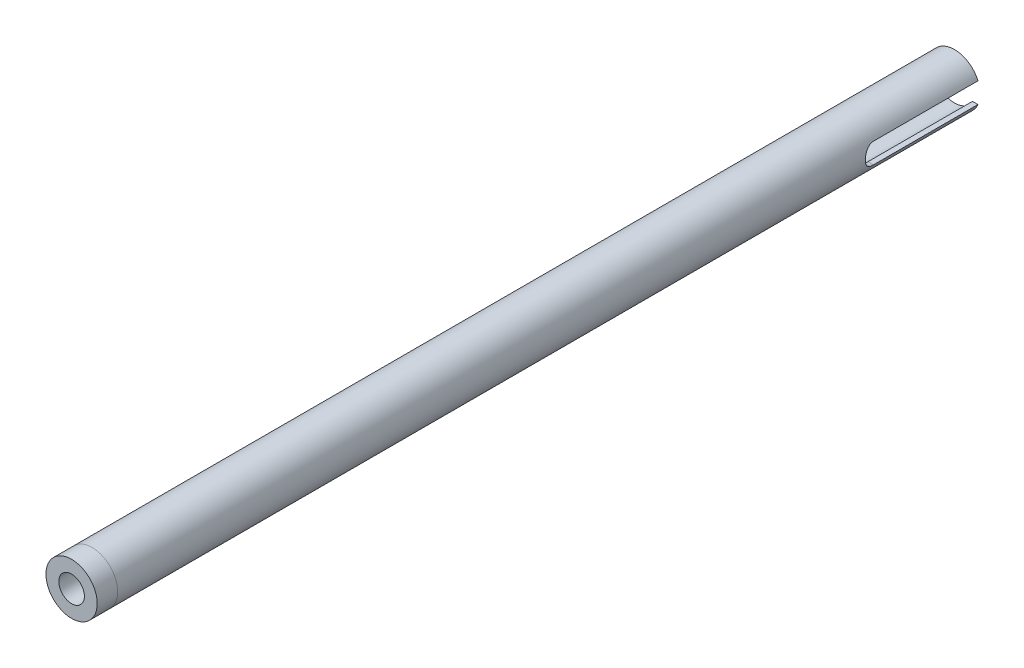
ISO-10303-21;
HEADER;
FILE_DESCRIPTION(('STEP AP214'),'2;1');
FILE_NAME('part.step','',(''),(''),'','','');
FILE_SCHEMA(('AUTOMOTIVE_DESIGN { 1 0 10303 214 1 1 1 1 }'));
ENDSEC;
DATA;
#1=APPLICATION_CONTEXT('core data for automotive mechanical design processes');
#2=APPLICATION_PROTOCOL_DEFINITION('international standard','automotive_design',2000,#1);
#3=PRODUCT_CONTEXT('',#1,'mechanical');
#4=PRODUCT('Part','Part','',(#3));
#5=PRODUCT_RELATED_PRODUCT_CATEGORY('part','',(#4));
#6=PRODUCT_DEFINITION_FORMATION('','',#4);
#7=PRODUCT_DEFINITION_CONTEXT('part definition',#1,'design');
#8=PRODUCT_DEFINITION('design','',#6,#7);
#9=PRODUCT_DEFINITION_SHAPE('','',#8);
#10=(LENGTH_UNIT() NAMED_UNIT(*) SI_UNIT(.MILLI.,.METRE.));
#11=(NAMED_UNIT(*) PLANE_ANGLE_UNIT() SI_UNIT($,.RADIAN.));
#12=(NAMED_UNIT(*) SI_UNIT($,.STERADIAN.) SOLID_ANGLE_UNIT());
#13=UNCERTAINTY_MEASURE_WITH_UNIT(LENGTH_MEASURE(1.E-05),#10,'distance_accuracy_value','');
#14=(GEOMETRIC_REPRESENTATION_CONTEXT(3) GLOBAL_UNCERTAINTY_ASSIGNED_CONTEXT((#13)) GLOBAL_UNIT_ASSIGNED_CONTEXT((#10,
#11,#12)) REPRESENTATION_CONTEXT('',''));
#15=CARTESIAN_POINT('',(0.,0.,0.));
#16=DIRECTION('',(0.,0.,1.));
#17=DIRECTION('',(1.,0.,0.));
#18=AXIS2_PLACEMENT_3D('',#15,#16,#17);
#19=CARTESIAN_POINT('',(0.,0.,-273.485359932268));
#20=DIRECTION('',(0.,0.,1.));
#21=DIRECTION('',(1.,0.,0.));
#22=AXIS2_PLACEMENT_3D('',#19,#20,#21);
#23=CYLINDRICAL_SURFACE('',#22,7.9375);
#24=CARTESIAN_POINT('',(0.,0.,-6.35));
#25=DIRECTION('',(0.,0.,1.));
#26=DIRECTION('',(1.,0.,0.));
#27=AXIS2_PLACEMENT_3D('',#24,#25,#26);
#28=CIRCLE('',#27,7.9375);
#29=CARTESIAN_POINT('',(7.9375,0.,-6.35));
#30=VERTEX_POINT('',#29);
#31=EDGE_CURVE('E167',#30,#30,#28,.T.);
#32=ORIENTED_EDGE('',*,*,#31,.F.);
#33=EDGE_LOOP('',(#32));
#34=FACE_BOUND('',#33,.T.);
#35=CARTESIAN_POINT('',(-7.2748389157424,3.175,-241.100359932268));
#36=CARTESIAN_POINT('',(-7.27482137043434,3.17501267173453,-241.014939816786));
#37=CARTESIAN_POINT('',(-7.27634297592672,3.17155313247793,-240.929529287223));
#38=CARTESIAN_POINT('',(-7.28233338484875,3.15778866907725,-240.759397282895));
#39=CARTESIAN_POINT('',(-7.28680106535325,3.14748635311323,-240.674675558036));
#40=CARTESIAN_POINT('',(-7.29852916312671,3.12019002880163,-240.506861858227));
#41=CARTESIAN_POINT('',(-7.30577831906487,3.10322299732752,-240.423764713468));
#42=CARTESIAN_POINT('',(-7.32282161153745,3.06278779397034,-240.259453611442));
#43=CARTESIAN_POINT('',(-7.33261590324725,3.03931922568673,-240.178239769329));
#44=CARTESIAN_POINT('',(-7.36535331460444,2.9595292434296,-239.938414946746));
#45=CARTESIAN_POINT('',(-7.3916759567784,2.89376893609236,-239.783290017943));
#46=CARTESIAN_POINT('',(-7.45033259991548,2.73920602658921,-239.486202591231));
#47=CARTESIAN_POINT('',(-7.48267254395243,2.65038060922871,-239.344253316014));
#48=CARTESIAN_POINT('',(-7.55175295441386,2.44684429809695,-239.069532546494));
#49=CARTESIAN_POINT('',(-7.58863404630154,2.33103943595689,-238.937605161982));
#50=CARTESIAN_POINT('',(-7.66147718953598,2.07914562663536,-238.69444227835));
#51=CARTESIAN_POINT('',(-7.69743902899202,1.94305205135847,-238.583211513423));
#52=CARTESIAN_POINT('',(-7.76611692840652,1.64778282664419,-238.380290313927));
#53=CARTESIAN_POINT('',(-7.79864638434712,1.48790317306356,-238.289555902523));
#54=CARTESIAN_POINT('',(-7.85502980346525,1.15369615984564,-238.136698349106));
#55=CARTESIAN_POINT('',(-7.87889360585224,0.979385463602719,-238.074542736488));
#56=CARTESIAN_POINT('',(-7.91022225039827,0.670405323433344,-237.994031092832));
#57=CARTESIAN_POINT('',(-7.92038443902171,0.537888188660429,-237.968353169423));
#58=CARTESIAN_POINT('',(-7.93061686811603,0.337231082382099,-237.942598086342));
#59=CARTESIAN_POINT('',(-7.93319257341971,0.269991647180292,-237.936139989061));
#60=CARTESIAN_POINT('',(-7.93663621925193,0.135173873369592,-237.927518971309));
#61=CARTESIAN_POINT('',(-7.93750363389236,0.0675954368175841,-237.925357373491));
#62=CARTESIAN_POINT('',(-7.9375,0.,-237.925359932268));
#63=B_SPLINE_CURVE_WITH_KNOTS('',3,(#35,#36,#37,#38,#39,#40,#41,#42,#43,#44,#45,#46,#47,#48,#49,
#50,#51,#52,#53,#54,#55,#56,#57,#58,#59,#60,#61,#62),.UNSPECIFIED.,.F.,.F.,(4,2,2,2,2,2,2,2,2,2,
2,2,2,4),(0.,0.25616079739664,0.512224013007086,0.767261264672294,1.02231406945474,
1.53142416248601,2.041039780479,2.57679273649399,3.11266809162684,3.66991136029741,
4.22651992730647,4.63134321412667,4.83399375866621,5.03670667834029),.UNSPECIFIED.);
#64=CARTESIAN_POINT('',(-7.2748389157424,3.175,-241.100359932268));
#65=VERTEX_POINT('',#64);
#66=CARTESIAN_POINT('',(-7.9375,0.,-237.925359932268));
#67=VERTEX_POINT('',#66);
#68=EDGE_CURVE('E194',#65,#67,#63,.T.);
#69=ORIENTED_EDGE('',*,*,#68,.T.);
#70=CARTESIAN_POINT('',(-7.9375,0.,-237.925359932268));
#71=CARTESIAN_POINT('',(-7.93751279435796,-0.0856973243893161,-237.925347902099));
#72=CARTESIAN_POINT('',(-7.93611246860092,-0.171386675169289,-237.928829269571));
#73=CARTESIAN_POINT('',(-7.93058107051394,-0.342092796869087,-237.942685364906));
#74=CARTESIAN_POINT('',(-7.92645080745519,-0.427109759557717,-237.953058049889));
#75=CARTESIAN_POINT('',(-7.91557399086504,-0.595570690948318,-237.980555243956));
#76=CARTESIAN_POINT('',(-7.90883664469869,-0.679019123580009,-237.997655995229));
#77=CARTESIAN_POINT('',(-7.89293284658536,-0.844038966454647,-238.038423242703));
#78=CARTESIAN_POINT('',(-7.88376629739099,-0.925610301410308,-238.062090001759));
#79=CARTESIAN_POINT('',(-7.8529700783248,-1.16656173687589,-238.142597657458));
#80=CARTESIAN_POINT('',(-7.82802544143957,-1.32244720282991,-238.208990290335));
#81=CARTESIAN_POINT('',(-7.77174407779742,-1.6208190257289,-238.365035694328));
#82=CARTESIAN_POINT('',(-7.74040257287306,-1.76329524966532,-238.454705866391));
#83=CARTESIAN_POINT('',(-7.67287736621953,-2.03755465224645,-238.659159473906));
#84=CARTESIAN_POINT('',(-7.63654472176442,-2.16862853615059,-238.774846330638));
#85=CARTESIAN_POINT('',(-7.56380976030912,-2.41011022612819,-239.026140432347));
#86=CARTESIAN_POINT('',(-7.52740741976911,-2.52050895891189,-239.161756376829));
#87=CARTESIAN_POINT('',(-7.45683282624283,-2.72240939900244,-239.456454871696));
#88=CARTESIAN_POINT('',(-7.42283467350379,-2.81283701743192,-239.616318861611));
#89=CARTESIAN_POINT('',(-7.36333622196319,-2.9651189416839,-239.950444826408));
#90=CARTESIAN_POINT('',(-7.33782422493328,-3.02701262758154,-240.124686564167));
#91=CARTESIAN_POINT('',(-7.30424985403508,-3.10695047193343,-240.432990288818));
#92=CARTESIAN_POINT('',(-7.29331360019112,-3.13238569878911,-240.564849049704));
#93=CARTESIAN_POINT('',(-7.2822797767429,-3.15790858319002,-240.764565931398));
#94=CARTESIAN_POINT('',(-7.27949685702346,-3.16431127275807,-240.831514222158));
#95=CARTESIAN_POINT('',(-7.27577355567174,-3.17285909036155,-240.965755780024));
#96=CARTESIAN_POINT('',(-7.27483380475762,-3.17500276099679,-241.033049157322));
#97=CARTESIAN_POINT('',(-7.2748389157424,-3.175,-241.100359932268));
#98=B_SPLINE_CURVE_WITH_KNOTS('',3,(#70,#71,#72,#73,#74,#75,#76,#77,#78,#79,#80,#81,#82,#83,#84,
#85,#86,#87,#88,#89,#90,#91,#92,#93,#94,#95,#96,#97),.UNSPECIFIED.,.F.,.F.,(4,2,2,2,2,2,2,2,2,2,
2,2,2,4),(0.,0.256996432008006,0.513916713336977,0.769937797705395,1.02596913282158,
1.53722547809955,2.04886511530061,2.58219314099272,3.115754672018,3.67332953074265,
4.23013255190376,4.63306130520187,4.83485003827449,5.03670780985621),.UNSPECIFIED.);
#99=CARTESIAN_POINT('',(-7.2748389157424,-3.175,-241.100359932268));
#100=VERTEX_POINT('',#99);
#101=EDGE_CURVE('E146',#67,#100,#98,.T.);
#102=ORIENTED_EDGE('',*,*,#101,.T.);
#103=DIRECTION('',(0.,0.,-1.));
#104=VECTOR('',#103,1.);
#105=CARTESIAN_POINT('',(-7.2748389157424,-3.175,-237.925359932268));
#106=LINE('',#105,#104);
#107=CARTESIAN_POINT('',(-7.2748389157424,-3.175,-273.485359932268));
#108=VERTEX_POINT('',#107);
#109=EDGE_CURVE('E141',#100,#108,#106,.T.);
#110=ORIENTED_EDGE('',*,*,#109,.T.);
#111=CARTESIAN_POINT('',(0.,0.,-273.485359932268));
#112=DIRECTION('',(0.,0.,1.));
#113=DIRECTION('',(1.,0.,0.));
#114=AXIS2_PLACEMENT_3D('',#111,#112,#113);
#115=CIRCLE('',#114,7.9375);
#116=CARTESIAN_POINT('',(7.2748389157424,-3.175,-273.485359932268));
#117=VERTEX_POINT('',#116);
#118=EDGE_CURVE('E144',#108,#117,#115,.T.);
#119=ORIENTED_EDGE('',*,*,#118,.T.);
#120=DIRECTION('',(0.,0.,-1.));
#121=VECTOR('',#120,1.);
#122=CARTESIAN_POINT('',(7.2748389157424,-3.175,-237.925359932268));
#123=LINE('',#122,#121);
#124=CARTESIAN_POINT('',(7.2748389157424,-3.175,-241.100359932268));
#125=VERTEX_POINT('',#124);
#126=EDGE_CURVE('E427',#125,#117,#123,.T.);
#127=ORIENTED_EDGE('',*,*,#126,.F.);
#128=CARTESIAN_POINT('',(7.2748389157424,-3.175,-241.100359932268));
#129=CARTESIAN_POINT('',(7.27482137043434,-3.17501267173453,-241.014939816786));
#130=CARTESIAN_POINT('',(7.27634297592672,-3.17155313247793,-240.929529287223));
#131=CARTESIAN_POINT('',(7.28233338484875,-3.15778866907725,-240.759397282895));
#132=CARTESIAN_POINT('',(7.28680106535325,-3.14748635311323,-240.674675558036));
#133=CARTESIAN_POINT('',(7.29852916312671,-3.12019002880163,-240.506861858227));
#134=CARTESIAN_POINT('',(7.30577831906487,-3.10322299732752,-240.423764713468));
#135=CARTESIAN_POINT('',(7.32282161153745,-3.06278779397034,-240.259453611442));
#136=CARTESIAN_POINT('',(7.33261590324725,-3.03931922568673,-240.178239769329));
#137=CARTESIAN_POINT('',(7.36535331460444,-2.9595292434296,-239.938414946746));
#138=CARTESIAN_POINT('',(7.3916759567784,-2.89376893609236,-239.783290017943));
#139=CARTESIAN_POINT('',(7.45033259991548,-2.73920602658921,-239.486202591231));
#140=CARTESIAN_POINT('',(7.48267254395243,-2.65038060922871,-239.344253316014));
#141=CARTESIAN_POINT('',(7.55175295441386,-2.44684429809695,-239.069532546494));
#142=CARTESIAN_POINT('',(7.58863404630154,-2.33103943595689,-238.937605161982));
#143=CARTESIAN_POINT('',(7.66147718953598,-2.07914562663536,-238.69444227835));
#144=CARTESIAN_POINT('',(7.69743902899202,-1.94305205135847,-238.583211513423));
#145=CARTESIAN_POINT('',(7.76611692840652,-1.64778282664419,-238.380290313927));
#146=CARTESIAN_POINT('',(7.79864638434712,-1.48790317306356,-238.289555902523));
#147=CARTESIAN_POINT('',(7.85502980346525,-1.15369615984564,-238.136698349106));
#148=CARTESIAN_POINT('',(7.87889360585224,-0.979385463602719,-238.074542736488));
#149=CARTESIAN_POINT('',(7.91022225039827,-0.670405323433344,-237.994031092832));
#150=CARTESIAN_POINT('',(7.92038443902171,-0.537888188660429,-237.968353169423));
#151=CARTESIAN_POINT('',(7.93061686811603,-0.337231082382099,-237.942598086342));
#152=CARTESIAN_POINT('',(7.93319257341971,-0.269991647180292,-237.936139989061));
#153=CARTESIAN_POINT('',(7.93663621925193,-0.135173873369592,-237.927518971309));
#154=CARTESIAN_POINT('',(7.93750363389236,-0.0675954368175841,-237.925357373491));
#155=CARTESIAN_POINT('',(7.9375,0.,-237.925359932268));
#156=B_SPLINE_CURVE_WITH_KNOTS('',3,(#128,#129,#130,#131,#132,#133,#134,#135,#136,#137,#138,
#139,#140,#141,#142,#143,#144,#145,#146,#147,#148,#149,#150,#151,#152,#153,#154,#155),
.UNSPECIFIED.,.F.,.F.,(4,2,2,2,2,2,2,2,2,2,2,2,2,4),(0.,0.25616079739664,0.512224013007086,
0.767261264672294,1.02231406945474,1.53142416248601,2.041039780479,2.57679273649399,
3.11266809162684,3.66991136029741,4.22651992730647,4.63134321412667,4.83399375866621,
5.03670667834029),.UNSPECIFIED.);
#157=CARTESIAN_POINT('',(7.9375,0.,-237.925359932268));
#158=VERTEX_POINT('',#157);
#159=EDGE_CURVE('E87',#125,#158,#156,.T.);
#160=ORIENTED_EDGE('',*,*,#159,.T.);
#161=CARTESIAN_POINT('',(7.9375,0.,-237.925359932268));
#162=CARTESIAN_POINT('',(7.93751279435796,0.0856973243893161,-237.925347902099));
#163=CARTESIAN_POINT('',(7.93611246860092,0.171386675169289,-237.928829269571));
#164=CARTESIAN_POINT('',(7.93058107051394,0.342092796869087,-237.942685364906));
#165=CARTESIAN_POINT('',(7.92645080745519,0.427109759557717,-237.953058049889));
#166=CARTESIAN_POINT('',(7.91557399086504,0.595570690948318,-237.980555243956));
#167=CARTESIAN_POINT('',(7.90883664469869,0.679019123580009,-237.997655995229));
#168=CARTESIAN_POINT('',(7.89293284658536,0.844038966454647,-238.038423242703));
#169=CARTESIAN_POINT('',(7.88376629739099,0.925610301410308,-238.062090001759));
#170=CARTESIAN_POINT('',(7.8529700783248,1.16656173687589,-238.142597657458));
#171=CARTESIAN_POINT('',(7.82802544143957,1.32244720282991,-238.208990290335));
#172=CARTESIAN_POINT('',(7.77174407779742,1.6208190257289,-238.365035694328));
#173=CARTESIAN_POINT('',(7.74040257287306,1.76329524966532,-238.454705866391));
#174=CARTESIAN_POINT('',(7.67287736621953,2.03755465224645,-238.659159473906));
#175=CARTESIAN_POINT('',(7.63654472176442,2.16862853615059,-238.774846330638));
#176=CARTESIAN_POINT('',(7.56380976030912,2.41011022612819,-239.026140432347));
#177=CARTESIAN_POINT('',(7.52740741976911,2.52050895891189,-239.161756376829));
#178=CARTESIAN_POINT('',(7.45683282624283,2.72240939900244,-239.456454871696));
#179=CARTESIAN_POINT('',(7.42283467350379,2.81283701743192,-239.616318861611));
#180=CARTESIAN_POINT('',(7.36333622196319,2.9651189416839,-239.950444826408));
#181=CARTESIAN_POINT('',(7.33782422493328,3.02701262758154,-240.124686564167));
#182=CARTESIAN_POINT('',(7.30424985403508,3.10695047193343,-240.432990288818));
#183=CARTESIAN_POINT('',(7.29331360019112,3.13238569878911,-240.564849049704));
#184=CARTESIAN_POINT('',(7.2822797767429,3.15790858319002,-240.764565931398));
#185=CARTESIAN_POINT('',(7.27949685702346,3.16431127275807,-240.831514222158));
#186=CARTESIAN_POINT('',(7.27577355567174,3.17285909036155,-240.965755780024));
#187=CARTESIAN_POINT('',(7.27483380475762,3.17500276099679,-241.033049157322));
#188=CARTESIAN_POINT('',(7.2748389157424,3.175,-241.100359932268));
#189=B_SPLINE_CURVE_WITH_KNOTS('',3,(#161,#162,#163,#164,#165,#166,#167,#168,#169,#170,#171,
#172,#173,#174,#175,#176,#177,#178,#179,#180,#181,#182,#183,#184,#185,#186,#187,#188),
.UNSPECIFIED.,.F.,.F.,(4,2,2,2,2,2,2,2,2,2,2,2,2,4),(0.,0.256996432008006,0.513916713336977,
0.769937797705395,1.02596913282158,1.53722547809955,2.04886511530061,2.58219314099272,
3.115754672018,3.67332953074265,4.23013255190376,4.63306130520187,4.83485003827449,
5.03670780985621),.UNSPECIFIED.);
#190=CARTESIAN_POINT('',(7.2748389157424,3.175,-241.100359932268));
#191=VERTEX_POINT('',#190);
#192=EDGE_CURVE('E73',#158,#191,#189,.T.);
#193=ORIENTED_EDGE('',*,*,#192,.T.);
#194=DIRECTION('',(0.,0.,-1.));
#195=VECTOR('',#194,1.);
#196=CARTESIAN_POINT('',(7.2748389157424,3.175,-237.925359932268));
#197=LINE('',#196,#195);
#198=CARTESIAN_POINT('',(7.2748389157424,3.175,-273.485359932268));
#199=VERTEX_POINT('',#198);
#200=EDGE_CURVE('E160',#191,#199,#197,.T.);
#201=ORIENTED_EDGE('',*,*,#200,.T.);
#202=CARTESIAN_POINT('',(-7.2748389157424,3.175,-273.485359932268));
#203=VERTEX_POINT('',#202);
#204=EDGE_CURVE('E166',#199,#203,#115,.T.);
#205=ORIENTED_EDGE('',*,*,#204,.T.);
#206=DIRECTION('',(0.,0.,-1.));
#207=VECTOR('',#206,1.);
#208=CARTESIAN_POINT('',(-7.2748389157424,3.175,-237.925359932268));
#209=LINE('',#208,#207);
#210=EDGE_CURVE('E420',#65,#203,#209,.T.);
#211=ORIENTED_EDGE('',*,*,#210,.F.);
#212=EDGE_LOOP('',(#69,#102,#110,#119,#127,#160,#193,#201,#205,#211));
#213=FACE_BOUND('',#212,.T.);
#214=ADVANCED_FACE('F63',(#34,#213),#23,.T.);
#215=CARTESIAN_POINT('',(0.,0.,-273.485359932268));
#216=DIRECTION('',(0.,0.,1.));
#217=DIRECTION('',(1.,0.,0.));
#218=AXIS2_PLACEMENT_3D('',#215,#216,#217);
#219=PLANE('',#218);
#220=DIRECTION('',(1.,0.,0.));
#221=VECTOR('',#220,1.);
#222=CARTESIAN_POINT('',(0.,-3.175,-273.485359932268));
#223=LINE('',#222,#221);
#224=CARTESIAN_POINT('',(-5.57246419907746,-3.175,-273.485359932268));
#225=VERTEX_POINT('',#224);
#226=EDGE_CURVE('E153',#108,#225,#223,.T.);
#227=ORIENTED_EDGE('',*,*,#226,.T.);
#228=CARTESIAN_POINT('',(0.,0.,-273.485359932268));
#229=DIRECTION('',(0.,0.,1.));
#230=DIRECTION('',(1.,0.,0.));
#231=AXIS2_PLACEMENT_3D('',#228,#229,#230);
#232=CIRCLE('',#231,6.4135);
#233=CARTESIAN_POINT('',(5.57246419907746,-3.175,-273.485359932268));
#234=VERTEX_POINT('',#233);
#235=EDGE_CURVE('E275',#225,#234,#232,.T.);
#236=ORIENTED_EDGE('',*,*,#235,.T.);
#237=DIRECTION('',(1.,0.,0.));
#238=VECTOR('',#237,1.);
#239=CARTESIAN_POINT('',(0.,-3.175,-273.485359932268));
#240=LINE('',#239,#238);
#241=EDGE_CURVE('E165',#234,#117,#240,.T.);
#242=ORIENTED_EDGE('',*,*,#241,.T.);
#243=ORIENTED_EDGE('',*,*,#118,.F.);
#244=EDGE_LOOP('',(#227,#236,#242,#243));
#245=FACE_BOUND('',#244,.T.);
#246=ADVANCED_FACE('F163',(#245),#219,.F.);
#247=CARTESIAN_POINT('',(0.,0.,-273.485359932268));
#248=DIRECTION('',(0.,0.,1.));
#249=DIRECTION('',(1.,0.,0.));
#250=AXIS2_PLACEMENT_3D('',#247,#248,#249);
#251=CYLINDRICAL_SURFACE('',#250,6.4135);
#252=CARTESIAN_POINT('',(0.,0.,-6.35));
#253=DIRECTION('',(0.,0.,1.));
#254=DIRECTION('',(1.,0.,0.));
#255=AXIS2_PLACEMENT_3D('',#252,#253,#254);
#256=CIRCLE('',#255,6.4135);
#257=CARTESIAN_POINT('',(6.4135,0.,-6.35));
#258=VERTEX_POINT('',#257);
#259=EDGE_CURVE('E149',#258,#258,#256,.T.);
#260=ORIENTED_EDGE('',*,*,#259,.T.);
#261=EDGE_LOOP('',(#260));
#262=FACE_BOUND('',#261,.T.);
#263=DIRECTION('',(0.,0.,-1.));
#264=VECTOR('',#263,1.);
#265=CARTESIAN_POINT('',(-5.57246419907746,-3.175,-237.925359932268));
#266=LINE('',#265,#264);
#267=CARTESIAN_POINT('',(-5.57246419907746,-3.175,-241.100359932268));
#268=VERTEX_POINT('',#267);
#269=EDGE_CURVE('E150',#268,#225,#266,.T.);
#270=ORIENTED_EDGE('',*,*,#269,.F.);
#271=CARTESIAN_POINT('',(-5.57246419907746,-3.175,-241.100359932268));
#272=CARTESIAN_POINT('',(-5.57244013006406,-3.17501485930532,-241.01708081923));
#273=CARTESIAN_POINT('',(-5.57433046393328,-3.17172393593588,-240.933815052359));
#274=CARTESIAN_POINT('',(-5.58175879139226,-3.1586474174694,-240.768007467547));
#275=CARTESIAN_POINT('',(-5.58729459414878,-3.14886572313218,-240.685465244946));
#276=CARTESIAN_POINT('',(-5.60179156831921,-3.12299843383607,-240.522168438217));
#277=CARTESIAN_POINT('',(-5.61073298145,-3.10694918790096,-240.441406333303));
#278=CARTESIAN_POINT('',(-5.63171276239417,-3.068756659135,-240.281762417802));
#279=CARTESIAN_POINT('',(-5.64375147558632,-3.04661269666536,-240.202880817982));
#280=CARTESIAN_POINT('',(-5.6838799338154,-2.97148657354666,-239.970147642984));
#281=CARTESIAN_POINT('',(-5.71602843451585,-2.9097324304215,-239.819727145745));
#282=CARTESIAN_POINT('',(-5.78746445334563,-2.76491119647658,-239.531269928917));
#283=CARTESIAN_POINT('',(-5.82676307252431,-2.68181088046088,-239.393252971551));
#284=CARTESIAN_POINT('',(-5.91189137020973,-2.48887418737119,-239.121455887523));
#285=CARTESIAN_POINT('',(-5.95799203211626,-2.37743022169017,-238.988899085071));
#286=CARTESIAN_POINT('',(-6.04933625068999,-2.13433179626949,-238.743431415999));
#287=CARTESIAN_POINT('',(-6.09457954365872,-2.00267122837296,-238.630526508986));
#288=CARTESIAN_POINT('',(-6.18270630442022,-1.71220053093682,-238.420207216534));
#289=CARTESIAN_POINT('',(-6.22523407848511,-1.55216870534976,-238.324317466102));
#290=CARTESIAN_POINT('',(-6.29953728626817,-1.21586879246633,-238.161468569785));
#291=CARTESIAN_POINT('',(-6.33132906884324,-1.03962591706377,-238.094465391742));
#292=CARTESIAN_POINT('',(-6.37455801221378,-0.71941894247625,-238.004593559412));
#293=CARTESIAN_POINT('',(-6.38903678436651,-0.577736145507954,-237.975020845047));
#294=CARTESIAN_POINT('',(-6.40364692368403,-0.362616983152033,-237.945299770733));
#295=CARTESIAN_POINT('',(-6.40733246196224,-0.290370591494073,-237.937832258095));
#296=CARTESIAN_POINT('',(-6.41226237468065,-0.145424356491902,-237.927859369157));
#297=CARTESIAN_POINT('',(-6.41350576158006,-0.0727243416303689,-237.92535600022));
#298=CARTESIAN_POINT('',(-6.4135,0.,-237.925359932268));
#299=B_SPLINE_CURVE_WITH_KNOTS('',3,(#271,#272,#273,#274,#275,#276,#277,#278,#279,#280,#281,
#282,#283,#284,#285,#286,#287,#288,#289,#290,#291,#292,#293,#294,#295,#296,#297,#298),
.UNSPECIFIED.,.F.,.F.,(4,2,2,2,2,2,2,2,2,2,2,2,2,4),(0.,0.249729002226553,0.499308060527525,
0.74746066754666,0.995640957972498,1.49055300136661,1.98624009021396,2.52160227908799,
3.05712653941521,3.62817923327587,4.19835836008503,4.63305000595098,4.85103401853339,
5.06910615989468),.UNSPECIFIED.);
#300=CARTESIAN_POINT('',(-6.4135,0.,-237.925359932268));
#301=VERTEX_POINT('',#300);
#302=EDGE_CURVE('E221',#268,#301,#299,.T.);
#303=ORIENTED_EDGE('',*,*,#302,.T.);
#304=CARTESIAN_POINT('',(-6.4135,0.,-237.925359932268));
#305=CARTESIAN_POINT('',(-6.41351478956106,0.0839162873638162,-237.925346532372));
#306=CARTESIAN_POINT('',(-6.41185341043851,0.167823114288179,-237.928686458419));
#307=CARTESIAN_POINT('',(-6.40528923860734,0.334952536326369,-237.941968899024));
#308=CARTESIAN_POINT('',(-6.40038773102953,0.418175389480092,-237.951908795845));
#309=CARTESIAN_POINT('',(-6.38748331817869,0.582965498785221,-237.978227600363));
#310=CARTESIAN_POINT('',(-6.37949454331383,0.664538541389254,-237.994577175851));
#311=CARTESIAN_POINT('',(-6.36062930478242,0.825821595252371,-238.033515479444));
#312=CARTESIAN_POINT('',(-6.34975266552956,0.905531492908815,-238.056104586925));
#313=CARTESIAN_POINT('',(-6.31319792977547,1.14087800407252,-238.132841149685));
#314=CARTESIAN_POINT('',(-6.28356695572382,1.29306927815056,-238.196012797873));
#315=CARTESIAN_POINT('',(-6.216480326228,1.58455945770356,-238.344163539853));
#316=CARTESIAN_POINT('',(-6.17901685649498,1.72384528592311,-238.429164431632));
#317=CARTESIAN_POINT('',(-6.09713913910646,1.99475482128858,-238.624264569884));
#318=CARTESIAN_POINT('',(-6.05244508581476,2.12544046453043,-238.735549446622));
#319=CARTESIAN_POINT('',(-5.96206469267669,2.36716277188881,-238.977518892787));
#320=CARTESIAN_POINT('',(-5.91637760323869,2.47818397002904,-239.108218584627));
#321=CARTESIAN_POINT('',(-5.82517699615971,2.68591268931948,-239.397264413579));
#322=CARTESIAN_POINT('',(-5.77994318763785,2.78087960507694,-239.556959608159));
#323=CARTESIAN_POINT('',(-5.69959190124919,2.94207442790849,-239.892342885341));
#324=CARTESIAN_POINT('',(-5.66445328320705,3.00836254036258,-240.067996518513));
#325=CARTESIAN_POINT('',(-5.61637168534323,3.09697219420915,-240.386447892906));
#326=CARTESIAN_POINT('',(-5.60011055849822,3.1260622343607,-240.526862495566));
#327=CARTESIAN_POINT('',(-5.58363385282995,3.15533369889112,-240.740239373808));
#328=CARTESIAN_POINT('',(-5.57946041232981,3.16269716900745,-240.81197109869));
#329=CARTESIAN_POINT('',(-5.57386984218861,3.17253394278506,-240.955913038733));
#330=CARTESIAN_POINT('',(-5.57245416126573,3.17500467618403,-241.028123485404));
#331=CARTESIAN_POINT('',(-5.57246419907746,3.175,-241.100359932268));
#332=B_SPLINE_CURVE_WITH_KNOTS('',3,(#304,#305,#306,#307,#308,#309,#310,#311,#312,#313,#314,
#315,#316,#317,#318,#319,#320,#321,#322,#323,#324,#325,#326,#327,#328,#329,#330,#331),
.UNSPECIFIED.,.F.,.F.,(4,2,2,2,2,2,2,2,2,2,2,2,2,4),(0.,0.251650249697327,0.503200747298844,
0.753613280993145,1.00404104361823,1.50387930503277,2.00421864304454,2.53410176460239,
3.06439980342594,3.63519589642624,4.20478783377489,4.63602373673191,4.85251353275901,
5.06911702550462),.UNSPECIFIED.);
#333=CARTESIAN_POINT('',(-5.57246419907746,3.175,-241.100359932268));
#334=VERTEX_POINT('',#333);
#335=EDGE_CURVE('E186',#301,#334,#332,.T.);
#336=ORIENTED_EDGE('',*,*,#335,.T.);
#337=DIRECTION('',(0.,0.,-1.));
#338=VECTOR('',#337,1.);
#339=CARTESIAN_POINT('',(-5.57246419907746,3.175,-237.925359932268));
#340=LINE('',#339,#338);
#341=CARTESIAN_POINT('',(-5.57246419907746,3.175,-273.485359932268));
#342=VERTEX_POINT('',#341);
#343=EDGE_CURVE('E417',#334,#342,#340,.T.);
#344=ORIENTED_EDGE('',*,*,#343,.T.);
#345=CARTESIAN_POINT('',(5.57246419907746,3.175,-273.485359932268));
#346=VERTEX_POINT('',#345);
#347=EDGE_CURVE('E172',#346,#342,#232,.T.);
#348=ORIENTED_EDGE('',*,*,#347,.F.);
#349=DIRECTION('',(0.,0.,-1.));
#350=VECTOR('',#349,1.);
#351=CARTESIAN_POINT('',(5.57246419907746,3.175,-237.925359932268));
#352=LINE('',#351,#350);
#353=CARTESIAN_POINT('',(5.57246419907746,3.175,-241.100359932268));
#354=VERTEX_POINT('',#353);
#355=EDGE_CURVE('E269',#354,#346,#352,.T.);
#356=ORIENTED_EDGE('',*,*,#355,.F.);
#357=CARTESIAN_POINT('',(5.57246419907746,3.175,-241.100359932268));
#358=CARTESIAN_POINT('',(5.57244013006406,3.17501485930532,-241.01708081923));
#359=CARTESIAN_POINT('',(5.57433046393328,3.17172393593588,-240.933815052359));
#360=CARTESIAN_POINT('',(5.58175879139226,3.1586474174694,-240.768007467547));
#361=CARTESIAN_POINT('',(5.58729459414878,3.14886572313218,-240.685465244946));
#362=CARTESIAN_POINT('',(5.60179156831921,3.12299843383607,-240.522168438217));
#363=CARTESIAN_POINT('',(5.61073298145,3.10694918790096,-240.441406333303));
#364=CARTESIAN_POINT('',(5.63171276239417,3.068756659135,-240.281762417802));
#365=CARTESIAN_POINT('',(5.64375147558632,3.04661269666536,-240.202880817982));
#366=CARTESIAN_POINT('',(5.6838799338154,2.97148657354666,-239.970147642984));
#367=CARTESIAN_POINT('',(5.71602843451585,2.9097324304215,-239.819727145745));
#368=CARTESIAN_POINT('',(5.78746445334563,2.76491119647658,-239.531269928917));
#369=CARTESIAN_POINT('',(5.82676307252431,2.68181088046088,-239.393252971551));
#370=CARTESIAN_POINT('',(5.91189137020973,2.48887418737119,-239.121455887523));
#371=CARTESIAN_POINT('',(5.95799203211626,2.37743022169017,-238.988899085071));
#372=CARTESIAN_POINT('',(6.04933625068999,2.13433179626949,-238.743431415999));
#373=CARTESIAN_POINT('',(6.09457954365872,2.00267122837296,-238.630526508986));
#374=CARTESIAN_POINT('',(6.18270630442022,1.71220053093682,-238.420207216534));
#375=CARTESIAN_POINT('',(6.22523407848511,1.55216870534976,-238.324317466102));
#376=CARTESIAN_POINT('',(6.29953728626817,1.21586879246633,-238.161468569785));
#377=CARTESIAN_POINT('',(6.33132906884324,1.03962591706377,-238.094465391742));
#378=CARTESIAN_POINT('',(6.37455801221378,0.71941894247625,-238.004593559412));
#379=CARTESIAN_POINT('',(6.38903678436651,0.577736145507954,-237.975020845047));
#380=CARTESIAN_POINT('',(6.40364692368403,0.362616983152033,-237.945299770733));
#381=CARTESIAN_POINT('',(6.40733246196224,0.290370591494073,-237.937832258095));
#382=CARTESIAN_POINT('',(6.41226237468065,0.145424356491902,-237.927859369157));
#383=CARTESIAN_POINT('',(6.41350576158006,0.0727243416303689,-237.92535600022));
#384=CARTESIAN_POINT('',(6.4135,0.,-237.925359932268));
#385=B_SPLINE_CURVE_WITH_KNOTS('',3,(#357,#358,#359,#360,#361,#362,#363,#364,#365,#366,#367,
#368,#369,#370,#371,#372,#373,#374,#375,#376,#377,#378,#379,#380,#381,#382,#383,#384),
.UNSPECIFIED.,.F.,.F.,(4,2,2,2,2,2,2,2,2,2,2,2,2,4),(0.,0.249729002226553,0.499308060527525,
0.74746066754666,0.995640957972498,1.49055300136661,1.98624009021396,2.52160227908799,
3.05712653941521,3.62817923327587,4.19835836008503,4.63305000595098,4.85103401853339,
5.06910615989468),.UNSPECIFIED.);
#386=CARTESIAN_POINT('',(6.4135,0.,-237.925359932268));
#387=VERTEX_POINT('',#386);
#388=EDGE_CURVE('E13',#354,#387,#385,.T.);
#389=ORIENTED_EDGE('',*,*,#388,.T.);
#390=CARTESIAN_POINT('',(6.4135,0.,-237.925359932268));
#391=CARTESIAN_POINT('',(6.41351478956106,-0.0839162873638162,-237.925346532372));
#392=CARTESIAN_POINT('',(6.41185341043851,-0.167823114288179,-237.928686458419));
#393=CARTESIAN_POINT('',(6.40528923860734,-0.334952536326369,-237.941968899024));
#394=CARTESIAN_POINT('',(6.40038773102953,-0.418175389480092,-237.951908795845));
#395=CARTESIAN_POINT('',(6.38748331817869,-0.582965498785221,-237.978227600363));
#396=CARTESIAN_POINT('',(6.37949454331383,-0.664538541389254,-237.994577175851));
#397=CARTESIAN_POINT('',(6.36062930478242,-0.825821595252371,-238.033515479444));
#398=CARTESIAN_POINT('',(6.34975266552956,-0.905531492908815,-238.056104586925));
#399=CARTESIAN_POINT('',(6.31319792977547,-1.14087800407252,-238.132841149685));
#400=CARTESIAN_POINT('',(6.28356695572382,-1.29306927815056,-238.196012797873));
#401=CARTESIAN_POINT('',(6.216480326228,-1.58455945770356,-238.344163539853));
#402=CARTESIAN_POINT('',(6.17901685649498,-1.72384528592311,-238.429164431632));
#403=CARTESIAN_POINT('',(6.09713913910646,-1.99475482128858,-238.624264569884));
#404=CARTESIAN_POINT('',(6.05244508581476,-2.12544046453043,-238.735549446622));
#405=CARTESIAN_POINT('',(5.96206469267669,-2.36716277188881,-238.977518892787));
#406=CARTESIAN_POINT('',(5.91637760323869,-2.47818397002904,-239.108218584627));
#407=CARTESIAN_POINT('',(5.82517699615971,-2.68591268931948,-239.397264413579));
#408=CARTESIAN_POINT('',(5.77994318763785,-2.78087960507694,-239.556959608159));
#409=CARTESIAN_POINT('',(5.69959190124919,-2.94207442790849,-239.892342885341));
#410=CARTESIAN_POINT('',(5.66445328320705,-3.00836254036258,-240.067996518513));
#411=CARTESIAN_POINT('',(5.61637168534323,-3.09697219420915,-240.386447892906));
#412=CARTESIAN_POINT('',(5.60011055849822,-3.1260622343607,-240.526862495566));
#413=CARTESIAN_POINT('',(5.58363385282995,-3.15533369889112,-240.740239373808));
#414=CARTESIAN_POINT('',(5.57946041232981,-3.16269716900745,-240.81197109869));
#415=CARTESIAN_POINT('',(5.57386984218861,-3.17253394278506,-240.955913038733));
#416=CARTESIAN_POINT('',(5.57245416126573,-3.17500467618403,-241.028123485404));
#417=CARTESIAN_POINT('',(5.57246419907746,-3.175,-241.100359932268));
#418=B_SPLINE_CURVE_WITH_KNOTS('',3,(#390,#391,#392,#393,#394,#395,#396,#397,#398,#399,#400,
#401,#402,#403,#404,#405,#406,#407,#408,#409,#410,#411,#412,#413,#414,#415,#416,#417),
.UNSPECIFIED.,.F.,.F.,(4,2,2,2,2,2,2,2,2,2,2,2,2,4),(0.,0.251650249697327,0.503200747298844,
0.753613280993145,1.00404104361823,1.50387930503277,2.00421864304454,2.53410176460239,
3.06439980342594,3.63519589642624,4.20478783377489,4.63602373673191,4.85251353275901,
5.06911702550462),.UNSPECIFIED.);
#419=CARTESIAN_POINT('',(5.57246419907746,-3.175,-241.100359932268));
#420=VERTEX_POINT('',#419);
#421=EDGE_CURVE('E237',#387,#420,#418,.T.);
#422=ORIENTED_EDGE('',*,*,#421,.T.);
#423=DIRECTION('',(0.,0.,-1.));
#424=VECTOR('',#423,1.);
#425=CARTESIAN_POINT('',(5.57246419907746,-3.175,-237.925359932268));
#426=LINE('',#425,#424);
#427=EDGE_CURVE('E271',#420,#234,#426,.T.);
#428=ORIENTED_EDGE('',*,*,#427,.T.);
#429=ORIENTED_EDGE('',*,*,#235,.F.);
#430=EDGE_LOOP('',(#270,#303,#336,#344,#348,#356,#389,#422,#428,#429));
#431=FACE_BOUND('',#430,.T.);
#432=ADVANCED_FACE('F201',(#262,#431),#251,.F.);
#433=ORIENTED_EDGE('',*,*,#347,.T.);
#434=DIRECTION('',(1.,0.,0.));
#435=VECTOR('',#434,1.);
#436=CARTESIAN_POINT('',(0.,3.175,-273.485359932268));
#437=LINE('',#436,#435);
#438=EDGE_CURVE('E159',#203,#342,#437,.T.);
#439=ORIENTED_EDGE('',*,*,#438,.F.);
#440=ORIENTED_EDGE('',*,*,#204,.F.);
#441=DIRECTION('',(1.,0.,0.));
#442=VECTOR('',#441,1.);
#443=CARTESIAN_POINT('',(0.,3.175,-273.485359932268));
#444=LINE('',#443,#442);
#445=EDGE_CURVE('E253',#346,#199,#444,.T.);
#446=ORIENTED_EDGE('',*,*,#445,.F.);
#447=EDGE_LOOP('',(#433,#439,#440,#446));
#448=FACE_BOUND('',#447,.T.);
#449=ADVANCED_FACE('F286',(#448),#219,.F.);
#450=CARTESIAN_POINT('',(0.,0.,-6.35));
#451=DIRECTION('',(0.,0.,1.));
#452=DIRECTION('',(1.,0.,0.));
#453=AXIS2_PLACEMENT_3D('',#450,#451,#452);
#454=PLANE('',#453);
#455=ORIENTED_EDGE('',*,*,#259,.F.);
#456=EDGE_LOOP('',(#455));
#457=FACE_BOUND('',#456,.T.);
#458=ORIENTED_EDGE('',*,*,#31,.T.);
#459=EDGE_LOOP('',(#458));
#460=FACE_BOUND('',#459,.T.);
#461=ADVANCED_FACE('F283',(#457,#460),#454,.T.);
#462=CARTESIAN_POINT('',(0.,3.175,-237.925359932268));
#463=DIRECTION('',(0.,1.,0.));
#464=DIRECTION('',(0.,0.,1.));
#465=AXIS2_PLACEMENT_3D('',#462,#463,#464);
#466=PLANE('',#465);
#467=ORIENTED_EDGE('',*,*,#200,.F.);
#468=DIRECTION('',(1.,0.,0.));
#469=VECTOR('',#468,1.);
#470=CARTESIAN_POINT('',(5.57246419907746,3.175,-241.100359932268));
#471=LINE('',#470,#469);
#472=EDGE_CURVE('E184',#191,#354,#471,.F.);
#473=ORIENTED_EDGE('',*,*,#472,.T.);
#474=ORIENTED_EDGE('',*,*,#355,.T.);
#475=ORIENTED_EDGE('',*,*,#445,.T.);
#476=EDGE_LOOP('',(#467,#473,#474,#475));
#477=FACE_BOUND('',#476,.T.);
#478=ADVANCED_FACE('F266',(#477),#466,.F.);
#479=CARTESIAN_POINT('',(0.,-3.175,-237.925359932268));
#480=DIRECTION('',(0.,1.,0.));
#481=DIRECTION('',(0.,0.,1.));
#482=AXIS2_PLACEMENT_3D('',#479,#480,#481);
#483=PLANE('',#482);
#484=ORIENTED_EDGE('',*,*,#427,.F.);
#485=DIRECTION('',(1.,0.,0.));
#486=VECTOR('',#485,1.);
#487=CARTESIAN_POINT('',(0.,-3.175,-241.100359932268));
#488=LINE('',#487,#486);
#489=EDGE_CURVE('E181',#420,#125,#488,.T.);
#490=ORIENTED_EDGE('',*,*,#489,.T.);
#491=ORIENTED_EDGE('',*,*,#126,.T.);
#492=ORIENTED_EDGE('',*,*,#241,.F.);
#493=EDGE_LOOP('',(#484,#490,#491,#492));
#494=FACE_BOUND('',#493,.T.);
#495=ADVANCED_FACE('F361',(#494),#483,.T.);
#496=CARTESIAN_POINT('',(0.,-3.175,-237.925359932268));
#497=DIRECTION('',(0.,1.,0.));
#498=DIRECTION('',(0.,0.,1.));
#499=AXIS2_PLACEMENT_3D('',#496,#497,#498);
#500=PLANE('',#499);
#501=ORIENTED_EDGE('',*,*,#109,.F.);
#502=DIRECTION('',(1.,0.,0.));
#503=VECTOR('',#502,1.);
#504=CARTESIAN_POINT('',(0.,-3.175,-241.100359932268));
#505=LINE('',#504,#503);
#506=EDGE_CURVE('E179',#100,#268,#505,.T.);
#507=ORIENTED_EDGE('',*,*,#506,.T.);
#508=ORIENTED_EDGE('',*,*,#269,.T.);
#509=ORIENTED_EDGE('',*,*,#226,.F.);
#510=EDGE_LOOP('',(#501,#507,#508,#509));
#511=FACE_BOUND('',#510,.T.);
#512=ADVANCED_FACE('F154',(#511),#500,.T.);
#513=CARTESIAN_POINT('',(0.,3.175,-237.925359932268));
#514=DIRECTION('',(0.,1.,0.));
#515=DIRECTION('',(0.,0.,1.));
#516=AXIS2_PLACEMENT_3D('',#513,#514,#515);
#517=PLANE('',#516);
#518=ORIENTED_EDGE('',*,*,#343,.F.);
#519=DIRECTION('',(1.,0.,0.));
#520=VECTOR('',#519,1.);
#521=CARTESIAN_POINT('',(-7.2748389157424,3.175,-241.100359932268));
#522=LINE('',#521,#520);
#523=EDGE_CURVE('E170',#334,#65,#522,.F.);
#524=ORIENTED_EDGE('',*,*,#523,.T.);
#525=ORIENTED_EDGE('',*,*,#210,.T.);
#526=ORIENTED_EDGE('',*,*,#438,.T.);
#527=EDGE_LOOP('',(#518,#524,#525,#526));
#528=FACE_BOUND('',#527,.T.);
#529=ADVANCED_FACE('F216',(#528),#517,.F.);
#530=CARTESIAN_POINT('',(0.,0.,-241.100359932268));
#531=DIRECTION('',(1.,0.,0.));
#532=DIRECTION('',(0.,0.,-1.));
#533=AXIS2_PLACEMENT_3D('',#530,#531,#532);
#534=CYLINDRICAL_SURFACE('',#533,3.175);
#535=ORIENTED_EDGE('',*,*,#506,.F.);
#536=ORIENTED_EDGE('',*,*,#101,.F.);
#537=DIRECTION('',(1.,0.,0.));
#538=VECTOR('',#537,1.);
#539=CARTESIAN_POINT('',(0.,0.,-237.925359932268));
#540=LINE('',#539,#538);
#541=EDGE_CURVE('E251',#301,#67,#540,.F.);
#542=ORIENTED_EDGE('',*,*,#541,.F.);
#543=ORIENTED_EDGE('',*,*,#302,.F.);
#544=EDGE_LOOP('',(#535,#536,#542,#543));
#545=FACE_BOUND('',#544,.T.);
#546=ADVANCED_FACE('F209',(#545),#534,.F.);
#547=CARTESIAN_POINT('',(0.,0.,-241.100359932268));
#548=DIRECTION('',(-1.,0.,0.));
#549=DIRECTION('',(0.,0.,1.));
#550=AXIS2_PLACEMENT_3D('',#547,#548,#549);
#551=CYLINDRICAL_SURFACE('',#550,3.175);
#552=ORIENTED_EDGE('',*,*,#68,.F.);
#553=ORIENTED_EDGE('',*,*,#523,.F.);
#554=ORIENTED_EDGE('',*,*,#335,.F.);
#555=ORIENTED_EDGE('',*,*,#541,.T.);
#556=EDGE_LOOP('',(#552,#553,#554,#555));
#557=FACE_BOUND('',#556,.T.);
#558=ADVANCED_FACE('F205',(#557),#551,.F.);
#559=CARTESIAN_POINT('',(0.,0.,-241.100359932268));
#560=DIRECTION('',(-1.,0.,0.));
#561=DIRECTION('',(0.,0.,1.));
#562=AXIS2_PLACEMENT_3D('',#559,#560,#561);
#563=CYLINDRICAL_SURFACE('',#562,3.175);
#564=DIRECTION('',(1.,0.,0.));
#565=VECTOR('',#564,1.);
#566=CARTESIAN_POINT('',(7.2748389157424,0.,-237.925359932268));
#567=LINE('',#566,#565);
#568=EDGE_CURVE('E68',#387,#158,#567,.T.);
#569=ORIENTED_EDGE('',*,*,#568,.F.);
#570=ORIENTED_EDGE('',*,*,#388,.F.);
#571=ORIENTED_EDGE('',*,*,#472,.F.);
#572=ORIENTED_EDGE('',*,*,#192,.F.);
#573=EDGE_LOOP('',(#569,#570,#571,#572));
#574=FACE_BOUND('',#573,.T.);
#575=ADVANCED_FACE('F65',(#574),#563,.F.);
#576=CARTESIAN_POINT('',(0.,0.,-241.100359932268));
#577=DIRECTION('',(1.,0.,0.));
#578=DIRECTION('',(0.,0.,-1.));
#579=AXIS2_PLACEMENT_3D('',#576,#577,#578);
#580=CYLINDRICAL_SURFACE('',#579,3.175);
#581=ORIENTED_EDGE('',*,*,#421,.F.);
#582=ORIENTED_EDGE('',*,*,#568,.T.);
#583=ORIENTED_EDGE('',*,*,#159,.F.);
#584=ORIENTED_EDGE('',*,*,#489,.F.);
#585=EDGE_LOOP('',(#581,#582,#583,#584));
#586=FACE_BOUND('',#585,.T.);
#587=ADVANCED_FACE('F218',(#586),#580,.F.);
#588=CLOSED_SHELL('',(#214,#246,#432,#449,#461,#478,#495,#512,#529,#546,#558,#575,#587));
#589=MANIFOLD_SOLID_BREP('B2',#588);
#590=CARTESIAN_POINT('',(0.,0.,-6.35));
#591=DIRECTION('',(0.,0.,1.));
#592=DIRECTION('',(1.,0.,0.));
#593=AXIS2_PLACEMENT_3D('',#590,#591,#592);
#594=CYLINDRICAL_SURFACE('',#593,7.9375);
#595=CARTESIAN_POINT('',(0.,0.,-6.35));
#596=DIRECTION('',(0.,0.,1.));
#597=DIRECTION('',(1.,0.,0.));
#598=AXIS2_PLACEMENT_3D('',#595,#596,#597);
#599=CIRCLE('',#598,7.9375);
#600=CARTESIAN_POINT('',(7.9375,0.,-6.35));
#601=VERTEX_POINT('',#600);
#602=EDGE_CURVE('E62',#601,#601,#599,.T.);
#603=ORIENTED_EDGE('',*,*,#602,.T.);
#604=EDGE_LOOP('',(#603));
#605=FACE_BOUND('',#604,.T.);
#606=CARTESIAN_POINT('',(0.,0.,0.));
#607=DIRECTION('',(0.,0.,1.));
#608=DIRECTION('',(1.,0.,0.));
#609=AXIS2_PLACEMENT_3D('',#606,#607,#608);
#610=CIRCLE('',#609,7.9375);
#611=CARTESIAN_POINT('',(7.9375,0.,0.));
#612=VERTEX_POINT('',#611);
#613=EDGE_CURVE('E465',#612,#612,#610,.T.);
#614=ORIENTED_EDGE('',*,*,#613,.F.);
#615=EDGE_LOOP('',(#614));
#616=FACE_BOUND('',#615,.T.);
#617=ADVANCED_FACE('F454',(#605,#616),#594,.T.);
#618=CARTESIAN_POINT('',(0.,0.,-6.35));
#619=DIRECTION('',(0.,0.,1.));
#620=DIRECTION('',(1.,0.,0.));
#621=AXIS2_PLACEMENT_3D('',#618,#619,#620);
#622=CYLINDRICAL_SURFACE('',#621,3.96875);
#623=CARTESIAN_POINT('',(0.,0.,0.));
#624=DIRECTION('',(0.,0.,1.));
#625=DIRECTION('',(1.,0.,0.));
#626=AXIS2_PLACEMENT_3D('',#623,#624,#625);
#627=CIRCLE('',#626,3.96875);
#628=CARTESIAN_POINT('',(3.96875,0.,0.));
#629=VERTEX_POINT('',#628);
#630=EDGE_CURVE('E457',#629,#629,#627,.T.);
#631=ORIENTED_EDGE('',*,*,#630,.T.);
#632=EDGE_LOOP('',(#631));
#633=FACE_BOUND('',#632,.T.);
#634=CARTESIAN_POINT('',(0.,0.,-15.875));
#635=DIRECTION('',(0.,0.,1.));
#636=DIRECTION('',(1.,0.,0.));
#637=AXIS2_PLACEMENT_3D('',#634,#635,#636);
#638=CIRCLE('',#637,3.96875);
#639=CARTESIAN_POINT('',(3.96875,0.,-15.875));
#640=VERTEX_POINT('',#639);
#641=EDGE_CURVE('E477',#640,#640,#638,.T.);
#642=ORIENTED_EDGE('',*,*,#641,.F.);
#643=EDGE_LOOP('',(#642));
#644=FACE_BOUND('',#643,.T.);
#645=ADVANCED_FACE('F485',(#633,#644),#622,.F.);
#646=CARTESIAN_POINT('',(0.,0.,-6.35));
#647=DIRECTION('',(0.,0.,1.));
#648=DIRECTION('',(1.,0.,0.));
#649=AXIS2_PLACEMENT_3D('',#646,#647,#648);
#650=PLANE('',#649);
#651=CARTESIAN_POINT('',(0.,0.,-6.35));
#652=DIRECTION('',(0.,0.,1.));
#653=DIRECTION('',(1.,0.,0.));
#654=AXIS2_PLACEMENT_3D('',#651,#652,#653);
#655=CIRCLE('',#654,6.4135);
#656=CARTESIAN_POINT('',(6.4135,0.,-6.35));
#657=VERTEX_POINT('',#656);
#658=EDGE_CURVE('E467',#657,#657,#655,.T.);
#659=ORIENTED_EDGE('',*,*,#658,.T.);
#660=EDGE_LOOP('',(#659));
#661=FACE_BOUND('',#660,.T.);
#662=ORIENTED_EDGE('',*,*,#602,.F.);
#663=EDGE_LOOP('',(#662));
#664=FACE_BOUND('',#663,.T.);
#665=ADVANCED_FACE('F487',(#661,#664),#650,.F.);
#666=CARTESIAN_POINT('',(0.,0.,0.));
#667=DIRECTION('',(0.,0.,1.));
#668=DIRECTION('',(1.,0.,0.));
#669=AXIS2_PLACEMENT_3D('',#666,#667,#668);
#670=PLANE('',#669);
#671=ORIENTED_EDGE('',*,*,#613,.T.);
#672=EDGE_LOOP('',(#671));
#673=FACE_BOUND('',#672,.T.);
#674=ORIENTED_EDGE('',*,*,#630,.F.);
#675=EDGE_LOOP('',(#674));
#676=FACE_BOUND('',#675,.T.);
#677=ADVANCED_FACE('F493',(#673,#676),#670,.T.);
#678=CARTESIAN_POINT('',(0.,0.,-15.875));
#679=DIRECTION('',(0.,0.,1.));
#680=DIRECTION('',(1.,0.,0.));
#681=AXIS2_PLACEMENT_3D('',#678,#679,#680);
#682=CYLINDRICAL_SURFACE('',#681,6.4135);
#683=CARTESIAN_POINT('',(0.,0.,-15.875));
#684=DIRECTION('',(0.,0.,1.));
#685=DIRECTION('',(1.,0.,0.));
#686=AXIS2_PLACEMENT_3D('',#683,#684,#685);
#687=CIRCLE('',#686,6.4135);
#688=CARTESIAN_POINT('',(6.4135,0.,-15.875));
#689=VERTEX_POINT('',#688);
#690=EDGE_CURVE('E470',#689,#689,#687,.T.);
#691=CARTESIAN_POINT('',(6.4135,0.,-15.875));
#692=CARTESIAN_POINT('',(6.4135,0.,-15.77578125));
#693=CARTESIAN_POINT('',(6.4135,0.,-15.6765625));
#694=CARTESIAN_POINT('',(6.4135,0.,-15.478125));
#695=CARTESIAN_POINT('',(6.4135,0.,-15.37890625));
#696=CARTESIAN_POINT('',(6.4135,0.,-15.18046875));
#697=CARTESIAN_POINT('',(6.4135,0.,-15.08125));
#698=CARTESIAN_POINT('',(6.4135,0.,-14.8828125));
#699=CARTESIAN_POINT('',(6.4135,0.,-14.78359375));
#700=CARTESIAN_POINT('',(6.4135,0.,-14.58515625));
#701=CARTESIAN_POINT('',(6.4135,0.,-14.4859375));
#702=CARTESIAN_POINT('',(6.4135,0.,-14.2875));
#703=CARTESIAN_POINT('',(6.4135,0.,-14.18828125));
#704=CARTESIAN_POINT('',(6.4135,0.,-13.98984375));
#705=CARTESIAN_POINT('',(6.4135,0.,-13.890625));
#706=CARTESIAN_POINT('',(6.4135,0.,-13.6921875));
#707=CARTESIAN_POINT('',(6.4135,0.,-13.59296875));
#708=CARTESIAN_POINT('',(6.4135,0.,-13.39453125));
#709=CARTESIAN_POINT('',(6.4135,0.,-13.2953125));
#710=CARTESIAN_POINT('',(6.4135,0.,-13.096875));
#711=CARTESIAN_POINT('',(6.4135,0.,-12.99765625));
#712=CARTESIAN_POINT('',(6.4135,0.,-12.79921875));
#713=CARTESIAN_POINT('',(6.4135,0.,-12.7));
#714=CARTESIAN_POINT('',(6.4135,0.,-12.5015625));
#715=CARTESIAN_POINT('',(6.4135,0.,-12.40234375));
#716=CARTESIAN_POINT('',(6.4135,0.,-12.20390625));
#717=CARTESIAN_POINT('',(6.4135,0.,-12.1046875));
#718=CARTESIAN_POINT('',(6.4135,0.,-11.90625));
#719=CARTESIAN_POINT('',(6.4135,0.,-11.80703125));
#720=CARTESIAN_POINT('',(6.4135,0.,-11.60859375));
#721=CARTESIAN_POINT('',(6.4135,0.,-11.509375));
#722=CARTESIAN_POINT('',(6.4135,0.,-11.3109375));
#723=CARTESIAN_POINT('',(6.4135,0.,-11.21171875));
#724=CARTESIAN_POINT('',(6.4135,0.,-11.01328125));
#725=CARTESIAN_POINT('',(6.4135,0.,-10.9140625));
#726=CARTESIAN_POINT('',(6.4135,0.,-10.715625));
#727=CARTESIAN_POINT('',(6.4135,0.,-10.61640625));
#728=CARTESIAN_POINT('',(6.4135,0.,-10.41796875));
#729=CARTESIAN_POINT('',(6.4135,0.,-10.31875));
#730=CARTESIAN_POINT('',(6.4135,0.,-10.1203125));
#731=CARTESIAN_POINT('',(6.4135,0.,-10.02109375));
#732=CARTESIAN_POINT('',(6.4135,0.,-9.82265625));
#733=CARTESIAN_POINT('',(6.4135,0.,-9.7234375));
#734=CARTESIAN_POINT('',(6.4135,0.,-9.525));
#735=CARTESIAN_POINT('',(6.4135,0.,-9.42578125));
#736=CARTESIAN_POINT('',(6.4135,0.,-9.22734375));
#737=CARTESIAN_POINT('',(6.4135,0.,-9.128125));
#738=CARTESIAN_POINT('',(6.4135,0.,-8.9296875));
#739=CARTESIAN_POINT('',(6.4135,0.,-8.83046875));
#740=CARTESIAN_POINT('',(6.4135,0.,-8.63203125));
#741=CARTESIAN_POINT('',(6.4135,0.,-8.5328125));
#742=CARTESIAN_POINT('',(6.4135,0.,-8.334375));
#743=CARTESIAN_POINT('',(6.4135,0.,-8.23515625));
#744=CARTESIAN_POINT('',(6.4135,0.,-8.03671875));
#745=CARTESIAN_POINT('',(6.4135,0.,-7.9375));
#746=CARTESIAN_POINT('',(6.4135,0.,-7.7390625));
#747=CARTESIAN_POINT('',(6.4135,0.,-7.63984375));
#748=CARTESIAN_POINT('',(6.4135,0.,-7.44140625));
#749=CARTESIAN_POINT('',(6.4135,0.,-7.3421875));
#750=CARTESIAN_POINT('',(6.4135,0.,-7.14375));
#751=CARTESIAN_POINT('',(6.4135,0.,-7.04453125));
#752=CARTESIAN_POINT('',(6.4135,0.,-6.84609375));
#753=CARTESIAN_POINT('',(6.4135,0.,-6.746875));
#754=CARTESIAN_POINT('',(6.4135,0.,-6.5484375));
#755=CARTESIAN_POINT('',(6.4135,0.,-6.44921875));
#756=CARTESIAN_POINT('',(6.4135,0.,-6.35));
#757=B_SPLINE_CURVE_WITH_KNOTS('',3,(#691,#692,#693,#694,#695,#696,#697,#698,#699,#700,#701,
#702,#703,#704,#705,#706,#707,#708,#709,#710,#711,#712,#713,#714,#715,#716,#717,#718,#719,#720,
#721,#722,#723,#724,#725,#726,#727,#728,#729,#730,#731,#732,#733,#734,#735,#736,#737,#738,#739,
#740,#741,#742,#743,#744,#745,#746,#747,#748,#749,#750,#751,#752,#753,#754,#755,#756),
.UNSPECIFIED.,.F.,.F.,(4,2,2,2,2,2,2,2,2,2,2,2,2,2,2,2,2,2,2,2,2,2,2,2,2,2,2,2,2,2,2,2,4),(0.,
0.297656250000002,0.595312500000002,0.892968750000002,1.190625,1.48828125,1.7859375,2.08359375,
2.38125,2.67890625,2.9765625,3.27421875,3.571875,3.86953125,4.1671875,4.46484375,4.7625,
5.06015625,5.3578125,5.65546875,5.953125,6.25078125,6.5484375,6.84609375,7.14375,7.44140625,
7.7390625,8.03671875,8.334375,8.63203125,8.9296875,9.22734375,9.525),.UNSPECIFIED.);
#758=EDGE_CURVE('BSEAM498',#689,#657,#757,.T.);
#759=ORIENTED_EDGE('',*,*,#690,.T.);
#760=ORIENTED_EDGE('',*,*,#658,.F.);
#761=ORIENTED_EDGE('',*,*,#758,.T.);
#762=ORIENTED_EDGE('',*,*,#758,.F.);
#763=EDGE_LOOP('',(#759,#761,#760,#762));
#764=FACE_BOUND('',#763,.T.);
#765=ADVANCED_FACE('F498',(#764),#682,.T.);
#766=CARTESIAN_POINT('',(0.,0.,-15.875));
#767=DIRECTION('',(0.,0.,1.));
#768=DIRECTION('',(1.,0.,0.));
#769=AXIS2_PLACEMENT_3D('',#766,#767,#768);
#770=PLANE('',#769);
#771=ORIENTED_EDGE('',*,*,#641,.T.);
#772=EDGE_LOOP('',(#771));
#773=FACE_BOUND('',#772,.T.);
#774=ORIENTED_EDGE('',*,*,#690,.F.);
#775=EDGE_LOOP('',(#774));
#776=FACE_BOUND('',#775,.T.);
#777=ADVANCED_FACE('F482',(#773,#776),#770,.F.);
#778=CLOSED_SHELL('',(#617,#645,#665,#677,#765,#777));
#779=MANIFOLD_SOLID_BREP('B7',#778);
#780=ADVANCED_BREP_SHAPE_REPRESENTATION('',(#18,#589,#779),#14);
#781=SHAPE_DEFINITION_REPRESENTATION(#9,#780);
ENDSEC;
END-ISO-10303-21;
